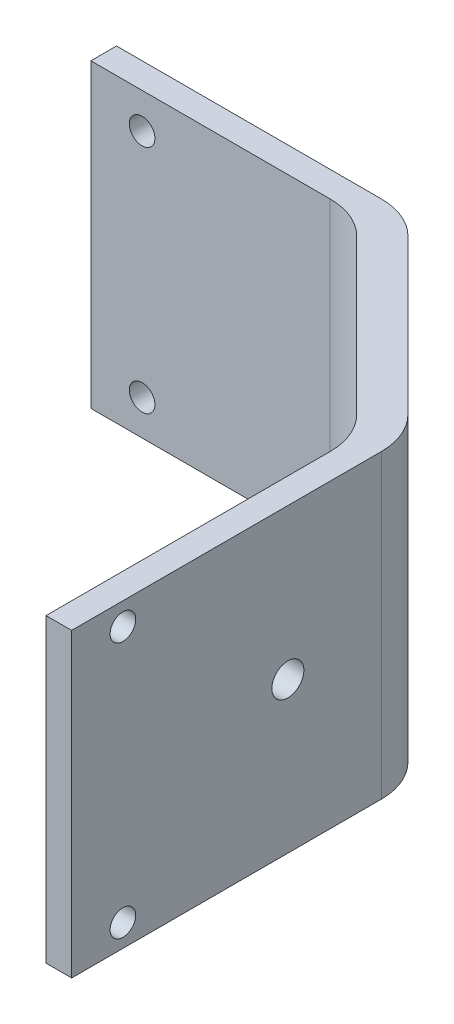
ISO-10303-21;
HEADER;
FILE_DESCRIPTION(('STEP AP214'),'2;1');
FILE_NAME('part.step','',(''),(''),'','','');
FILE_SCHEMA(('AUTOMOTIVE_DESIGN { 1 0 10303 214 1 1 1 1 }'));
ENDSEC;
DATA;
#1=APPLICATION_CONTEXT('core data for automotive mechanical design processes');
#2=APPLICATION_PROTOCOL_DEFINITION('international standard','automotive_design',2000,#1);
#3=PRODUCT_CONTEXT('',#1,'mechanical');
#4=PRODUCT('Part','Part','',(#3));
#5=PRODUCT_RELATED_PRODUCT_CATEGORY('part','',(#4));
#6=PRODUCT_DEFINITION_FORMATION('','',#4);
#7=PRODUCT_DEFINITION_CONTEXT('part definition',#1,'design');
#8=PRODUCT_DEFINITION('design','',#6,#7);
#9=PRODUCT_DEFINITION_SHAPE('','',#8);
#10=(LENGTH_UNIT() NAMED_UNIT(*) SI_UNIT(.MILLI.,.METRE.));
#11=(NAMED_UNIT(*) PLANE_ANGLE_UNIT() SI_UNIT($,.RADIAN.));
#12=(NAMED_UNIT(*) SI_UNIT($,.STERADIAN.) SOLID_ANGLE_UNIT());
#13=UNCERTAINTY_MEASURE_WITH_UNIT(LENGTH_MEASURE(1.E-05),#10,'distance_accuracy_value','');
#14=(GEOMETRIC_REPRESENTATION_CONTEXT(3) GLOBAL_UNCERTAINTY_ASSIGNED_CONTEXT((#13)) GLOBAL_UNIT_ASSIGNED_CONTEXT((#10,
#11,#12)) REPRESENTATION_CONTEXT('',''));
#15=CARTESIAN_POINT('',(0.,0.,0.));
#16=DIRECTION('',(0.,0.,1.));
#17=DIRECTION('',(1.,0.,0.));
#18=AXIS2_PLACEMENT_3D('',#15,#16,#17);
#19=CARTESIAN_POINT('',(0.,11.,4.));
#20=DIRECTION('',(1.,0.,0.));
#21=DIRECTION('',(0.,0.,-1.));
#22=AXIS2_PLACEMENT_3D('',#19,#20,#21);
#23=PLANE('',#22);
#24=DIRECTION('',(0.,-1.,0.));
#25=VECTOR('',#24,1.);
#26=CARTESIAN_POINT('',(0.,11.,0.));
#27=LINE('',#26,#25);
#28=CARTESIAN_POINT('',(0.,47.,0.));
#29=VERTEX_POINT('',#28);
#30=CARTESIAN_POINT('',(0.,0.,0.));
#31=VERTEX_POINT('',#30);
#32=EDGE_CURVE('E229',#29,#31,#27,.T.);
#33=ORIENTED_EDGE('',*,*,#32,.T.);
#34=DIRECTION('',(0.,0.,-1.));
#35=VECTOR('',#34,1.);
#36=CARTESIAN_POINT('',(0.,0.,4.));
#37=LINE('',#36,#35);
#38=CARTESIAN_POINT('',(0.,0.,4.));
#39=VERTEX_POINT('',#38);
#40=EDGE_CURVE('E238',#39,#31,#37,.T.);
#41=ORIENTED_EDGE('',*,*,#40,.F.);
#42=DIRECTION('',(0.,-1.,0.));
#43=VECTOR('',#42,1.);
#44=CARTESIAN_POINT('',(0.,11.,4.));
#45=LINE('',#44,#43);
#46=CARTESIAN_POINT('',(0.,47.,4.));
#47=VERTEX_POINT('',#46);
#48=EDGE_CURVE('E232',#47,#39,#45,.T.);
#49=ORIENTED_EDGE('',*,*,#48,.F.);
#50=DIRECTION('',(0.,0.,-1.));
#51=VECTOR('',#50,1.);
#52=CARTESIAN_POINT('',(0.,47.,80.2971165903404));
#53=LINE('',#52,#51);
#54=EDGE_CURVE('E221',#47,#29,#53,.T.);
#55=ORIENTED_EDGE('',*,*,#54,.T.);
#56=EDGE_LOOP('',(#33,#41,#49,#55));
#57=FACE_BOUND('',#56,.T.);
#58=ADVANCED_FACE('F67',(#57),#23,.F.);
#59=CARTESIAN_POINT('',(0.,0.,4.));
#60=DIRECTION('',(0.,1.,0.));
#61=DIRECTION('',(0.,0.,1.));
#62=AXIS2_PLACEMENT_3D('',#59,#60,#61);
#63=PLANE('',#62);
#64=DIRECTION('',(0.707106781186549,0.,0.707106781186546));
#65=VECTOR('',#64,1.);
#66=CARTESIAN_POINT('',(75.5,0.,30.));
#67=LINE('',#66,#65);
#68=CARTESIAN_POINT('',(48.4289321881344,0.,2.9289321881345));
#69=VERTEX_POINT('',#68);
#70=CARTESIAN_POINT('',(72.5710678118655,0.,27.0710678118655));
#71=VERTEX_POINT('',#70);
#72=EDGE_CURVE('E253',#69,#71,#67,.T.);
#73=ORIENTED_EDGE('',*,*,#72,.T.);
#74=CARTESIAN_POINT('',(65.5,0.,34.142135623731));
#75=DIRECTION('',(0.,1.,0.));
#76=DIRECTION('',(0.,0.,1.));
#77=AXIS2_PLACEMENT_3D('',#74,#75,#76);
#78=CIRCLE('',#77,10.);
#79=CARTESIAN_POINT('',(75.5,0.,34.142135623731));
#80=VERTEX_POINT('',#79);
#81=EDGE_CURVE('E162',#71,#80,#78,.F.);
#82=ORIENTED_EDGE('',*,*,#81,.T.);
#83=DIRECTION('',(0.,0.,-1.));
#84=VECTOR('',#83,1.);
#85=CARTESIAN_POINT('',(75.5,0.,0.));
#86=LINE('',#85,#84);
#87=CARTESIAN_POINT('',(75.5,0.,82.5));
#88=VERTEX_POINT('',#87);
#89=EDGE_CURVE('E155',#88,#80,#86,.T.);
#90=ORIENTED_EDGE('',*,*,#89,.F.);
#91=DIRECTION('',(1.,0.,0.));
#92=VECTOR('',#91,1.);
#93=CARTESIAN_POINT('',(24.4335576020452,0.,82.5));
#94=LINE('',#93,#92);
#95=CARTESIAN_POINT('',(71.5,0.,82.5));
#96=VERTEX_POINT('',#95);
#97=EDGE_CURVE('E160',#96,#88,#94,.T.);
#98=ORIENTED_EDGE('',*,*,#97,.F.);
#99=DIRECTION('',(0.,0.,-1.));
#100=VECTOR('',#99,1.);
#101=CARTESIAN_POINT('',(71.5,0.,80.));
#102=LINE('',#101,#100);
#103=CARTESIAN_POINT('',(71.5,0.,38.1421356237311));
#104=VERTEX_POINT('',#103);
#105=EDGE_CURVE('E168',#96,#104,#102,.T.);
#106=ORIENTED_EDGE('',*,*,#105,.T.);
#107=CARTESIAN_POINT('',(61.5,0.,38.1421356237311));
#108=DIRECTION('',(0.,1.,0.));
#109=DIRECTION('',(0.,0.,1.));
#110=AXIS2_PLACEMENT_3D('',#107,#108,#109);
#111=CIRCLE('',#110,10.);
#112=CARTESIAN_POINT('',(68.5710678118655,0.,31.0710678118657));
#113=VERTEX_POINT('',#112);
#114=EDGE_CURVE('E280',#104,#113,#111,.T.);
#115=ORIENTED_EDGE('',*,*,#114,.T.);
#116=DIRECTION('',(-0.707106781186544,0.,-0.707106781186551));
#117=VECTOR('',#116,1.);
#118=CARTESIAN_POINT('',(20.7500000000003,0.,-16.7500000000001));
#119=LINE('',#118,#117);
#120=CARTESIAN_POINT('',(44.4289321881346,0.,6.92893218813456));
#121=VERTEX_POINT('',#120);
#122=EDGE_CURVE('E245',#113,#121,#119,.T.);
#123=ORIENTED_EDGE('',*,*,#122,.T.);
#124=CARTESIAN_POINT('',(37.3578643762691,0.,14.));
#125=DIRECTION('',(0.,1.,0.));
#126=DIRECTION('',(0.,0.,1.));
#127=AXIS2_PLACEMENT_3D('',#124,#125,#126);
#128=CIRCLE('',#127,10.);
#129=CARTESIAN_POINT('',(37.3578643762691,0.,4.));
#130=VERTEX_POINT('',#129);
#131=EDGE_CURVE('E12',#121,#130,#128,.T.);
#132=ORIENTED_EDGE('',*,*,#131,.T.);
#133=DIRECTION('',(1.,0.,0.));
#134=VECTOR('',#133,1.);
#135=CARTESIAN_POINT('',(0.,0.,4.));
#136=LINE('',#135,#134);
#137=EDGE_CURVE('E235',#39,#130,#136,.T.);
#138=ORIENTED_EDGE('',*,*,#137,.F.);
#139=ORIENTED_EDGE('',*,*,#40,.T.);
#140=DIRECTION('',(1.,0.,0.));
#141=VECTOR('',#140,1.);
#142=CARTESIAN_POINT('',(0.,0.,0.));
#143=LINE('',#142,#141);
#144=CARTESIAN_POINT('',(41.357864376269,0.,0.));
#145=VERTEX_POINT('',#144);
#146=EDGE_CURVE('E236',#31,#145,#143,.T.);
#147=ORIENTED_EDGE('',*,*,#146,.T.);
#148=CARTESIAN_POINT('',(41.357864376269,0.,10.));
#149=DIRECTION('',(0.,1.,0.));
#150=DIRECTION('',(0.,0.,1.));
#151=AXIS2_PLACEMENT_3D('',#148,#149,#150);
#152=CIRCLE('',#151,10.);
#153=EDGE_CURVE('E265',#145,#69,#152,.F.);
#154=ORIENTED_EDGE('',*,*,#153,.T.);
#155=EDGE_LOOP('',(#73,#82,#90,#98,#106,#115,#123,#132,#138,#139,#147,#154));
#156=FACE_BOUND('',#155,.T.);
#157=ADVANCED_FACE('F158',(#156),#63,.F.);
#158=CARTESIAN_POINT('',(0.,0.,4.));
#159=DIRECTION('',(0.,0.,1.));
#160=DIRECTION('',(1.,0.,0.));
#161=AXIS2_PLACEMENT_3D('',#158,#159,#160);
#162=PLANE('',#161);
#163=ORIENTED_EDGE('',*,*,#137,.T.);
#164=DIRECTION('',(0.,1.,0.));
#165=VECTOR('',#164,1.);
#166=CARTESIAN_POINT('',(37.3578643762691,0.,4.));
#167=LINE('',#166,#165);
#168=CARTESIAN_POINT('',(37.3578643762691,47.,4.));
#169=VERTEX_POINT('',#168);
#170=EDGE_CURVE('E274',#130,#169,#167,.T.);
#171=ORIENTED_EDGE('',*,*,#170,.T.);
#172=DIRECTION('',(1.,0.,0.));
#173=VECTOR('',#172,1.);
#174=CARTESIAN_POINT('',(0.,47.,4.));
#175=LINE('',#174,#173);
#176=EDGE_CURVE('E209',#47,#169,#175,.T.);
#177=ORIENTED_EDGE('',*,*,#176,.F.);
#178=ORIENTED_EDGE('',*,*,#48,.T.);
#179=EDGE_LOOP('',(#163,#171,#177,#178));
#180=FACE_BOUND('',#179,.T.);
#181=CARTESIAN_POINT('',(8.,5.5,4.));
#182=DIRECTION('',(0.,0.,1.));
#183=DIRECTION('',(1.,0.,0.));
#184=AXIS2_PLACEMENT_3D('',#181,#182,#183);
#185=CIRCLE('',#184,2.);
#186=CARTESIAN_POINT('',(10.,5.5,4.));
#187=VERTEX_POINT('',#186);
#188=EDGE_CURVE('E167',#187,#187,#185,.T.);
#189=ORIENTED_EDGE('',*,*,#188,.F.);
#190=EDGE_LOOP('',(#189));
#191=FACE_BOUND('',#190,.T.);
#192=CARTESIAN_POINT('',(8.,41.5,4.));
#193=DIRECTION('',(0.,0.,1.));
#194=DIRECTION('',(1.,0.,0.));
#195=AXIS2_PLACEMENT_3D('',#192,#193,#194);
#196=CIRCLE('',#195,2.);
#197=CARTESIAN_POINT('',(10.,41.5,4.));
#198=VERTEX_POINT('',#197);
#199=EDGE_CURVE('E213',#198,#198,#196,.F.);
#200=ORIENTED_EDGE('',*,*,#199,.T.);
#201=EDGE_LOOP('',(#200));
#202=FACE_BOUND('',#201,.T.);
#203=ADVANCED_FACE('F294',(#180,#191,#202),#162,.T.);
#204=CARTESIAN_POINT('',(0.,0.,0.));
#205=DIRECTION('',(0.,0.,1.));
#206=DIRECTION('',(1.,0.,0.));
#207=AXIS2_PLACEMENT_3D('',#204,#205,#206);
#208=PLANE('',#207);
#209=CARTESIAN_POINT('',(8.,5.5,0.));
#210=DIRECTION('',(0.,0.,1.));
#211=DIRECTION('',(1.,0.,0.));
#212=AXIS2_PLACEMENT_3D('',#209,#210,#211);
#213=CIRCLE('',#212,2.);
#214=CARTESIAN_POINT('',(10.,5.5,0.));
#215=VERTEX_POINT('',#214);
#216=EDGE_CURVE('E226',#215,#215,#213,.T.);
#217=ORIENTED_EDGE('',*,*,#216,.T.);
#218=EDGE_LOOP('',(#217));
#219=FACE_BOUND('',#218,.T.);
#220=DIRECTION('',(1.,0.,0.));
#221=VECTOR('',#220,1.);
#222=CARTESIAN_POINT('',(0.,47.,0.));
#223=LINE('',#222,#221);
#224=CARTESIAN_POINT('',(41.357864376269,47.,0.));
#225=VERTEX_POINT('',#224);
#226=EDGE_CURVE('E218',#29,#225,#223,.T.);
#227=ORIENTED_EDGE('',*,*,#226,.T.);
#228=DIRECTION('',(0.,-1.,0.));
#229=VECTOR('',#228,1.);
#230=CARTESIAN_POINT('',(41.357864376269,0.,0.));
#231=LINE('',#230,#229);
#232=EDGE_CURVE('E277',#225,#145,#231,.T.);
#233=ORIENTED_EDGE('',*,*,#232,.T.);
#234=ORIENTED_EDGE('',*,*,#146,.F.);
#235=ORIENTED_EDGE('',*,*,#32,.F.);
#236=EDGE_LOOP('',(#227,#233,#234,#235));
#237=FACE_BOUND('',#236,.T.);
#238=CARTESIAN_POINT('',(8.,41.5,0.));
#239=DIRECTION('',(0.,0.,-1.));
#240=DIRECTION('',(-1.,0.,0.));
#241=AXIS2_PLACEMENT_3D('',#238,#239,#240);
#242=CIRCLE('',#241,2.);
#243=CARTESIAN_POINT('',(6.,41.5,0.));
#244=VERTEX_POINT('',#243);
#245=EDGE_CURVE('E212',#244,#244,#242,.T.);
#246=ORIENTED_EDGE('',*,*,#245,.F.);
#247=EDGE_LOOP('',(#246));
#248=FACE_BOUND('',#247,.T.);
#249=ADVANCED_FACE('F300',(#219,#237,#248),#208,.F.);
#250=CARTESIAN_POINT('',(8.,5.5,0.));
#251=DIRECTION('',(0.,0.,1.));
#252=DIRECTION('',(1.,0.,0.));
#253=AXIS2_PLACEMENT_3D('',#250,#251,#252);
#254=CYLINDRICAL_SURFACE('',#253,2.);
#255=ORIENTED_EDGE('',*,*,#216,.F.);
#256=EDGE_LOOP('',(#255));
#257=FACE_BOUND('',#256,.T.);
#258=ORIENTED_EDGE('',*,*,#188,.T.);
#259=EDGE_LOOP('',(#258));
#260=FACE_BOUND('',#259,.T.);
#261=ADVANCED_FACE('F373',(#257,#260),#254,.F.);
#262=CARTESIAN_POINT('',(75.5,0.,0.));
#263=DIRECTION('',(1.,0.,0.));
#264=DIRECTION('',(0.,0.,-1.));
#265=AXIS2_PLACEMENT_3D('',#262,#263,#264);
#266=PLANE('',#265);
#267=CARTESIAN_POINT('',(75.5,43.5,74.5));
#268=DIRECTION('',(1.,0.,0.));
#269=DIRECTION('',(0.,0.,-1.));
#270=AXIS2_PLACEMENT_3D('',#267,#268,#269);
#271=CIRCLE('',#270,2.);
#272=CARTESIAN_POINT('',(75.5,43.5,72.5));
#273=VERTEX_POINT('',#272);
#274=EDGE_CURVE('E188',#273,#273,#271,.T.);
#275=ORIENTED_EDGE('',*,*,#274,.F.);
#276=EDGE_LOOP('',(#275));
#277=FACE_BOUND('',#276,.T.);
#278=CARTESIAN_POINT('',(75.5,3.49999999999999,74.5));
#279=DIRECTION('',(1.,0.,0.));
#280=DIRECTION('',(0.,0.,-1.));
#281=AXIS2_PLACEMENT_3D('',#278,#279,#280);
#282=CIRCLE('',#281,2.);
#283=CARTESIAN_POINT('',(75.5,3.49999999999999,72.5));
#284=VERTEX_POINT('',#283);
#285=EDGE_CURVE('E192',#284,#284,#282,.T.);
#286=ORIENTED_EDGE('',*,*,#285,.F.);
#287=EDGE_LOOP('',(#286));
#288=FACE_BOUND('',#287,.T.);
#289=CARTESIAN_POINT('',(75.5,23.5,48.75));
#290=DIRECTION('',(1.,0.,0.));
#291=DIRECTION('',(0.,0.,-1.));
#292=AXIS2_PLACEMENT_3D('',#289,#290,#291);
#293=CIRCLE('',#292,2.5);
#294=CARTESIAN_POINT('',(75.5,23.5,46.25));
#295=VERTEX_POINT('',#294);
#296=EDGE_CURVE('E195',#295,#295,#293,.T.);
#297=ORIENTED_EDGE('',*,*,#296,.F.);
#298=EDGE_LOOP('',(#297));
#299=FACE_BOUND('',#298,.T.);
#300=ORIENTED_EDGE('',*,*,#89,.T.);
#301=DIRECTION('',(0.,1.,0.));
#302=VECTOR('',#301,1.);
#303=CARTESIAN_POINT('',(75.5,0.,34.142135623731));
#304=LINE('',#303,#302);
#305=CARTESIAN_POINT('',(75.5,47.,34.142135623731));
#306=VERTEX_POINT('',#305);
#307=EDGE_CURVE('E255',#80,#306,#304,.T.);
#308=ORIENTED_EDGE('',*,*,#307,.T.);
#309=DIRECTION('',(0.,0.,-1.));
#310=VECTOR('',#309,1.);
#311=CARTESIAN_POINT('',(75.5,47.,80.2971165903404));
#312=LINE('',#311,#310);
#313=CARTESIAN_POINT('',(75.5,47.,82.5));
#314=VERTEX_POINT('',#313);
#315=EDGE_CURVE('E182',#314,#306,#312,.T.);
#316=ORIENTED_EDGE('',*,*,#315,.F.);
#317=DIRECTION('',(0.,-1.,0.));
#318=VECTOR('',#317,1.);
#319=CARTESIAN_POINT('',(75.5,3.49999999999999,82.5));
#320=LINE('',#319,#318);
#321=EDGE_CURVE('E175',#314,#88,#320,.T.);
#322=ORIENTED_EDGE('',*,*,#321,.T.);
#323=EDGE_LOOP('',(#300,#308,#316,#322));
#324=FACE_BOUND('',#323,.T.);
#325=ADVANCED_FACE('F180',(#277,#288,#299,#324),#266,.T.);
#326=CARTESIAN_POINT('',(71.5,11.,80.));
#327=DIRECTION('',(1.,0.,0.));
#328=DIRECTION('',(0.,0.,-1.));
#329=AXIS2_PLACEMENT_3D('',#326,#327,#328);
#330=PLANE('',#329);
#331=CARTESIAN_POINT('',(71.5,43.5,74.5));
#332=DIRECTION('',(1.,0.,0.));
#333=DIRECTION('',(0.,0.,-1.));
#334=AXIS2_PLACEMENT_3D('',#331,#332,#333);
#335=CIRCLE('',#334,2.);
#336=CARTESIAN_POINT('',(71.5,43.5,72.5));
#337=VERTEX_POINT('',#336);
#338=EDGE_CURVE('E191',#337,#337,#335,.F.);
#339=ORIENTED_EDGE('',*,*,#338,.F.);
#340=EDGE_LOOP('',(#339));
#341=FACE_BOUND('',#340,.T.);
#342=CARTESIAN_POINT('',(71.5,3.49999999999999,74.5));
#343=DIRECTION('',(1.,0.,0.));
#344=DIRECTION('',(0.,0.,-1.));
#345=AXIS2_PLACEMENT_3D('',#342,#343,#344);
#346=CIRCLE('',#345,2.);
#347=CARTESIAN_POINT('',(71.5,3.49999999999999,72.5));
#348=VERTEX_POINT('',#347);
#349=EDGE_CURVE('E196',#348,#348,#346,.F.);
#350=ORIENTED_EDGE('',*,*,#349,.F.);
#351=EDGE_LOOP('',(#350));
#352=FACE_BOUND('',#351,.T.);
#353=CARTESIAN_POINT('',(71.5,23.5,48.75));
#354=DIRECTION('',(1.,0.,0.));
#355=DIRECTION('',(0.,0.,-1.));
#356=AXIS2_PLACEMENT_3D('',#353,#354,#355);
#357=CIRCLE('',#356,2.5);
#358=CARTESIAN_POINT('',(71.5,23.5,46.25));
#359=VERTEX_POINT('',#358);
#360=EDGE_CURVE('E203',#359,#359,#357,.F.);
#361=ORIENTED_EDGE('',*,*,#360,.F.);
#362=EDGE_LOOP('',(#361));
#363=FACE_BOUND('',#362,.T.);
#364=DIRECTION('',(0.,0.,-1.));
#365=VECTOR('',#364,1.);
#366=CARTESIAN_POINT('',(71.5,47.,0.));
#367=LINE('',#366,#365);
#368=CARTESIAN_POINT('',(71.5,47.,82.5));
#369=VERTEX_POINT('',#368);
#370=CARTESIAN_POINT('',(71.5,47.,38.1421356237311));
#371=VERTEX_POINT('',#370);
#372=EDGE_CURVE('E206',#369,#371,#367,.T.);
#373=ORIENTED_EDGE('',*,*,#372,.T.);
#374=DIRECTION('',(0.,-1.,0.));
#375=VECTOR('',#374,1.);
#376=CARTESIAN_POINT('',(71.5,0.,38.1421356237311));
#377=LINE('',#376,#375);
#378=EDGE_CURVE('E268',#371,#104,#377,.T.);
#379=ORIENTED_EDGE('',*,*,#378,.T.);
#380=ORIENTED_EDGE('',*,*,#105,.F.);
#381=DIRECTION('',(0.,1.,0.));
#382=VECTOR('',#381,1.);
#383=CARTESIAN_POINT('',(71.5,3.49999999999999,82.5));
#384=LINE('',#383,#382);
#385=EDGE_CURVE('E177',#96,#369,#384,.T.);
#386=ORIENTED_EDGE('',*,*,#385,.T.);
#387=EDGE_LOOP('',(#373,#379,#380,#386));
#388=FACE_BOUND('',#387,.T.);
#389=ADVANCED_FACE('F315',(#341,#352,#363,#388),#330,.F.);
#390=CARTESIAN_POINT('',(8.,41.5,80.2971165903404));
#391=DIRECTION('',(0.,0.,-1.));
#392=DIRECTION('',(-1.,0.,0.));
#393=AXIS2_PLACEMENT_3D('',#390,#391,#392);
#394=CYLINDRICAL_SURFACE('',#393,2.);
#395=ORIENTED_EDGE('',*,*,#245,.T.);
#396=EDGE_LOOP('',(#395));
#397=FACE_BOUND('',#396,.T.);
#398=ORIENTED_EDGE('',*,*,#199,.F.);
#399=EDGE_LOOP('',(#398));
#400=FACE_BOUND('',#399,.T.);
#401=ADVANCED_FACE('F364',(#397,#400),#394,.F.);
#402=CARTESIAN_POINT('',(0.,47.,80.2971165903404));
#403=DIRECTION('',(0.,1.,0.));
#404=DIRECTION('',(0.,0.,1.));
#405=AXIS2_PLACEMENT_3D('',#402,#403,#404);
#406=PLANE('',#405);
#407=ORIENTED_EDGE('',*,*,#315,.T.);
#408=CARTESIAN_POINT('',(65.5,47.,34.142135623731));
#409=DIRECTION('',(0.,1.,0.));
#410=DIRECTION('',(0.,0.,1.));
#411=AXIS2_PLACEMENT_3D('',#408,#409,#410);
#412=CIRCLE('',#411,10.);
#413=CARTESIAN_POINT('',(72.5710678118655,47.,27.0710678118655));
#414=VERTEX_POINT('',#413);
#415=EDGE_CURVE('E259',#306,#414,#412,.T.);
#416=ORIENTED_EDGE('',*,*,#415,.T.);
#417=DIRECTION('',(-0.707106781186549,0.,-0.707106781186546));
#418=VECTOR('',#417,1.);
#419=CARTESIAN_POINT('',(62.8985582951701,47.,17.3985582951701));
#420=LINE('',#419,#418);
#421=CARTESIAN_POINT('',(48.4289321881344,47.,2.9289321881345));
#422=VERTEX_POINT('',#421);
#423=EDGE_CURVE('E250',#414,#422,#420,.T.);
#424=ORIENTED_EDGE('',*,*,#423,.T.);
#425=CARTESIAN_POINT('',(41.357864376269,47.,10.));
#426=DIRECTION('',(0.,1.,0.));
#427=DIRECTION('',(0.,0.,1.));
#428=AXIS2_PLACEMENT_3D('',#425,#426,#427);
#429=CIRCLE('',#428,10.);
#430=EDGE_CURVE('E257',#422,#225,#429,.T.);
#431=ORIENTED_EDGE('',*,*,#430,.T.);
#432=ORIENTED_EDGE('',*,*,#226,.F.);
#433=ORIENTED_EDGE('',*,*,#54,.F.);
#434=ORIENTED_EDGE('',*,*,#176,.T.);
#435=CARTESIAN_POINT('',(37.3578643762691,47.,14.));
#436=DIRECTION('',(0.,1.,0.));
#437=DIRECTION('',(0.,0.,1.));
#438=AXIS2_PLACEMENT_3D('',#435,#436,#437);
#439=CIRCLE('',#438,10.);
#440=CARTESIAN_POINT('',(44.4289321881346,47.,6.92893218813457));
#441=VERTEX_POINT('',#440);
#442=EDGE_CURVE('E75',#169,#441,#439,.F.);
#443=ORIENTED_EDGE('',*,*,#442,.T.);
#444=DIRECTION('',(0.707106781186544,0.,0.707106781186551));
#445=VECTOR('',#444,1.);
#446=CARTESIAN_POINT('',(71.5,47.,34.0000000000002));
#447=LINE('',#446,#445);
#448=CARTESIAN_POINT('',(68.5710678118655,47.,31.0710678118657));
#449=VERTEX_POINT('',#448);
#450=EDGE_CURVE('E247',#441,#449,#447,.T.);
#451=ORIENTED_EDGE('',*,*,#450,.T.);
#452=CARTESIAN_POINT('',(61.5,47.,38.1421356237311));
#453=DIRECTION('',(0.,1.,0.));
#454=DIRECTION('',(0.,0.,1.));
#455=AXIS2_PLACEMENT_3D('',#452,#453,#454);
#456=CIRCLE('',#455,10.);
#457=EDGE_CURVE('E282',#449,#371,#456,.F.);
#458=ORIENTED_EDGE('',*,*,#457,.T.);
#459=ORIENTED_EDGE('',*,*,#372,.F.);
#460=DIRECTION('',(1.,0.,0.));
#461=VECTOR('',#460,1.);
#462=CARTESIAN_POINT('',(24.4335576020452,47.,82.5));
#463=LINE('',#462,#461);
#464=EDGE_CURVE('E178',#369,#314,#463,.T.);
#465=ORIENTED_EDGE('',*,*,#464,.T.);
#466=EDGE_LOOP('',(#407,#416,#424,#431,#432,#433,#434,#443,#451,#458,#459,#465));
#467=FACE_BOUND('',#466,.T.);
#468=ADVANCED_FACE('F284',(#467),#406,.T.);
#469=CARTESIAN_POINT('',(64.4289321881345,23.5,48.75));
#470=DIRECTION('',(1.,0.,0.));
#471=DIRECTION('',(0.,0.,-1.));
#472=AXIS2_PLACEMENT_3D('',#469,#470,#471);
#473=CYLINDRICAL_SURFACE('',#472,2.5);
#474=ORIENTED_EDGE('',*,*,#360,.T.);
#475=EDGE_LOOP('',(#474));
#476=FACE_BOUND('',#475,.T.);
#477=ORIENTED_EDGE('',*,*,#296,.T.);
#478=EDGE_LOOP('',(#477));
#479=FACE_BOUND('',#478,.T.);
#480=ADVANCED_FACE('F340',(#476,#479),#473,.F.);
#481=CARTESIAN_POINT('',(71.5,11.,34.0000000000002));
#482=DIRECTION('',(0.707106781186551,0.,-0.707106781186544));
#483=DIRECTION('',(0.,-1.,0.));
#484=AXIS2_PLACEMENT_3D('',#481,#482,#483);
#485=PLANE('',#484);
#486=ORIENTED_EDGE('',*,*,#122,.F.);
#487=DIRECTION('',(0.,-1.,0.));
#488=VECTOR('',#487,1.);
#489=CARTESIAN_POINT('',(68.5710678118655,47.,31.0710678118657));
#490=LINE('',#489,#488);
#491=EDGE_CURVE('E272',#113,#449,#490,.F.);
#492=ORIENTED_EDGE('',*,*,#491,.T.);
#493=ORIENTED_EDGE('',*,*,#450,.F.);
#494=DIRECTION('',(0.,1.,0.));
#495=VECTOR('',#494,1.);
#496=CARTESIAN_POINT('',(44.4289321881346,11.,6.92893218813457));
#497=LINE('',#496,#495);
#498=EDGE_CURVE('E88',#441,#121,#497,.F.);
#499=ORIENTED_EDGE('',*,*,#498,.T.);
#500=EDGE_LOOP('',(#486,#492,#493,#499));
#501=FACE_BOUND('',#500,.T.);
#502=ADVANCED_FACE('F290',(#501),#485,.F.);
#503=CARTESIAN_POINT('',(75.5,0.,30.));
#504=DIRECTION('',(0.707106781186546,0.,-0.707106781186549));
#505=DIRECTION('',(0.,-1.,0.));
#506=AXIS2_PLACEMENT_3D('',#503,#504,#505);
#507=PLANE('',#506);
#508=ORIENTED_EDGE('',*,*,#423,.F.);
#509=DIRECTION('',(0.,1.,0.));
#510=VECTOR('',#509,1.);
#511=CARTESIAN_POINT('',(72.5710678118655,0.,27.0710678118655));
#512=LINE('',#511,#510);
#513=EDGE_CURVE('E263',#414,#71,#512,.F.);
#514=ORIENTED_EDGE('',*,*,#513,.T.);
#515=ORIENTED_EDGE('',*,*,#72,.F.);
#516=DIRECTION('',(0.,-1.,0.));
#517=VECTOR('',#516,1.);
#518=CARTESIAN_POINT('',(48.4289321881344,47.,2.92893218813451));
#519=LINE('',#518,#517);
#520=EDGE_CURVE('E261',#69,#422,#519,.F.);
#521=ORIENTED_EDGE('',*,*,#520,.T.);
#522=EDGE_LOOP('',(#508,#514,#515,#521));
#523=FACE_BOUND('',#522,.T.);
#524=ADVANCED_FACE('F309',(#523),#507,.T.);
#525=CARTESIAN_POINT('',(65.8431457505076,3.49999999999999,74.5));
#526=DIRECTION('',(1.,0.,0.));
#527=DIRECTION('',(0.,0.,-1.));
#528=AXIS2_PLACEMENT_3D('',#525,#526,#527);
#529=CYLINDRICAL_SURFACE('',#528,2.);
#530=CARTESIAN_POINT('',(71.5,3.49999999999999,72.5));
#531=CARTESIAN_POINT('',(71.5416666666667,3.49999999999999,72.5));
#532=CARTESIAN_POINT('',(71.5833333333333,3.49999999999999,72.5));
#533=CARTESIAN_POINT('',(71.6666666666667,3.49999999999999,72.5));
#534=CARTESIAN_POINT('',(71.7083333333333,3.49999999999999,72.5));
#535=CARTESIAN_POINT('',(71.7916666666667,3.49999999999999,72.5));
#536=CARTESIAN_POINT('',(71.8333333333333,3.49999999999999,72.5));
#537=CARTESIAN_POINT('',(71.9166666666667,3.49999999999999,72.5));
#538=CARTESIAN_POINT('',(71.9583333333333,3.49999999999999,72.5));
#539=CARTESIAN_POINT('',(72.0416666666667,3.49999999999999,72.5));
#540=CARTESIAN_POINT('',(72.0833333333333,3.49999999999999,72.5));
#541=CARTESIAN_POINT('',(72.1666666666667,3.49999999999999,72.5));
#542=CARTESIAN_POINT('',(72.2083333333333,3.49999999999999,72.5));
#543=CARTESIAN_POINT('',(72.2916666666667,3.49999999999999,72.5));
#544=CARTESIAN_POINT('',(72.3333333333333,3.49999999999999,72.5));
#545=CARTESIAN_POINT('',(72.4166666666667,3.49999999999999,72.5));
#546=CARTESIAN_POINT('',(72.4583333333333,3.49999999999999,72.5));
#547=CARTESIAN_POINT('',(72.5416666666667,3.49999999999999,72.5));
#548=CARTESIAN_POINT('',(72.5833333333333,3.49999999999999,72.5));
#549=CARTESIAN_POINT('',(72.6666666666667,3.49999999999999,72.5));
#550=CARTESIAN_POINT('',(72.7083333333333,3.49999999999999,72.5));
#551=CARTESIAN_POINT('',(72.7916666666667,3.49999999999999,72.5));
#552=CARTESIAN_POINT('',(72.8333333333333,3.49999999999999,72.5));
#553=CARTESIAN_POINT('',(72.9166666666667,3.49999999999999,72.5));
#554=CARTESIAN_POINT('',(72.9583333333333,3.49999999999999,72.5));
#555=CARTESIAN_POINT('',(73.0416666666667,3.49999999999999,72.5));
#556=CARTESIAN_POINT('',(73.0833333333333,3.49999999999999,72.5));
#557=CARTESIAN_POINT('',(73.1666666666667,3.49999999999999,72.5));
#558=CARTESIAN_POINT('',(73.2083333333333,3.49999999999999,72.5));
#559=CARTESIAN_POINT('',(73.2916666666667,3.49999999999999,72.5));
#560=CARTESIAN_POINT('',(73.3333333333333,3.49999999999999,72.5));
#561=CARTESIAN_POINT('',(73.4166666666667,3.49999999999999,72.5));
#562=CARTESIAN_POINT('',(73.4583333333333,3.49999999999999,72.5));
#563=CARTESIAN_POINT('',(73.5416666666667,3.49999999999999,72.5));
#564=CARTESIAN_POINT('',(73.5833333333333,3.49999999999999,72.5));
#565=CARTESIAN_POINT('',(73.6666666666667,3.49999999999999,72.5));
#566=CARTESIAN_POINT('',(73.7083333333333,3.49999999999999,72.5));
#567=CARTESIAN_POINT('',(73.7916666666667,3.49999999999999,72.5));
#568=CARTESIAN_POINT('',(73.8333333333333,3.49999999999999,72.5));
#569=CARTESIAN_POINT('',(73.9166666666667,3.49999999999999,72.5));
#570=CARTESIAN_POINT('',(73.9583333333333,3.49999999999999,72.5));
#571=CARTESIAN_POINT('',(74.0416666666667,3.49999999999999,72.5));
#572=CARTESIAN_POINT('',(74.0833333333333,3.49999999999999,72.5));
#573=CARTESIAN_POINT('',(74.1666666666667,3.49999999999999,72.5));
#574=CARTESIAN_POINT('',(74.2083333333333,3.49999999999999,72.5));
#575=CARTESIAN_POINT('',(74.2916666666667,3.49999999999999,72.5));
#576=CARTESIAN_POINT('',(74.3333333333333,3.49999999999999,72.5));
#577=CARTESIAN_POINT('',(74.4166666666667,3.49999999999999,72.5));
#578=CARTESIAN_POINT('',(74.4583333333333,3.49999999999999,72.5));
#579=CARTESIAN_POINT('',(74.5416666666667,3.49999999999999,72.5));
#580=CARTESIAN_POINT('',(74.5833333333333,3.49999999999999,72.5));
#581=CARTESIAN_POINT('',(74.6666666666667,3.49999999999999,72.5));
#582=CARTESIAN_POINT('',(74.7083333333333,3.49999999999999,72.5));
#583=CARTESIAN_POINT('',(74.7916666666667,3.49999999999999,72.5));
#584=CARTESIAN_POINT('',(74.8333333333333,3.49999999999999,72.5));
#585=CARTESIAN_POINT('',(74.9166666666667,3.49999999999999,72.5));
#586=CARTESIAN_POINT('',(74.9583333333333,3.49999999999999,72.5));
#587=CARTESIAN_POINT('',(75.0416666666667,3.49999999999999,72.5));
#588=CARTESIAN_POINT('',(75.0833333333333,3.49999999999999,72.5));
#589=CARTESIAN_POINT('',(75.1666666666667,3.49999999999999,72.5));
#590=CARTESIAN_POINT('',(75.2083333333333,3.49999999999999,72.5));
#591=CARTESIAN_POINT('',(75.2916666666667,3.49999999999999,72.5));
#592=CARTESIAN_POINT('',(75.3333333333333,3.49999999999999,72.5));
#593=CARTESIAN_POINT('',(75.4166666666667,3.49999999999999,72.5));
#594=CARTESIAN_POINT('',(75.4583333333333,3.49999999999999,72.5));
#595=CARTESIAN_POINT('',(75.5,3.49999999999999,72.5));
#596=B_SPLINE_CURVE_WITH_KNOTS('',3,(#530,#531,#532,#533,#534,#535,#536,#537,#538,#539,#540,
#541,#542,#543,#544,#545,#546,#547,#548,#549,#550,#551,#552,#553,#554,#555,#556,#557,#558,#559,
#560,#561,#562,#563,#564,#565,#566,#567,#568,#569,#570,#571,#572,#573,#574,#575,#576,#577,#578,
#579,#580,#581,#582,#583,#584,#585,#586,#587,#588,#589,#590,#591,#592,#593,#594,#595),
.UNSPECIFIED.,.F.,.F.,(4,2,2,2,2,2,2,2,2,2,2,2,2,2,2,2,2,2,2,2,2,2,2,2,2,2,2,2,2,2,2,2,4),(0.,
0.125,0.25,0.375,0.5,0.625000000000001,0.750000000000001,0.875000000000001,1.,1.125,1.25,1.375,
1.5,1.625,1.75,1.875,2.,2.125,2.25,2.375,2.5,2.625,2.75,2.875,3.,3.125,3.25,3.375,3.5,3.625,
3.75,3.875,4.),.UNSPECIFIED.);
#597=EDGE_CURVE('BSEAM344',#348,#284,#596,.T.);
#598=ORIENTED_EDGE('',*,*,#349,.T.);
#599=ORIENTED_EDGE('',*,*,#285,.T.);
#600=ORIENTED_EDGE('',*,*,#597,.T.);
#601=ORIENTED_EDGE('',*,*,#597,.F.);
#602=EDGE_LOOP('',(#598,#600,#599,#601));
#603=FACE_BOUND('',#602,.T.);
#604=ADVANCED_FACE('F344',(#603),#529,.F.);
#605=CARTESIAN_POINT('',(65.8431457505076,43.5,74.5));
#606=DIRECTION('',(1.,0.,0.));
#607=DIRECTION('',(0.,0.,-1.));
#608=AXIS2_PLACEMENT_3D('',#605,#606,#607);
#609=CYLINDRICAL_SURFACE('',#608,2.);
#610=CARTESIAN_POINT('',(71.5,43.5,72.5));
#611=CARTESIAN_POINT('',(71.5416666666667,43.5,72.5));
#612=CARTESIAN_POINT('',(71.5833333333333,43.5,72.5));
#613=CARTESIAN_POINT('',(71.6666666666667,43.5,72.5));
#614=CARTESIAN_POINT('',(71.7083333333333,43.5,72.5));
#615=CARTESIAN_POINT('',(71.7916666666667,43.5,72.5));
#616=CARTESIAN_POINT('',(71.8333333333333,43.5,72.5));
#617=CARTESIAN_POINT('',(71.9166666666667,43.5,72.5));
#618=CARTESIAN_POINT('',(71.9583333333333,43.5,72.5));
#619=CARTESIAN_POINT('',(72.0416666666667,43.5,72.5));
#620=CARTESIAN_POINT('',(72.0833333333333,43.5,72.5));
#621=CARTESIAN_POINT('',(72.1666666666667,43.5,72.5));
#622=CARTESIAN_POINT('',(72.2083333333333,43.5,72.5));
#623=CARTESIAN_POINT('',(72.2916666666667,43.5,72.5));
#624=CARTESIAN_POINT('',(72.3333333333333,43.5,72.5));
#625=CARTESIAN_POINT('',(72.4166666666667,43.5,72.5));
#626=CARTESIAN_POINT('',(72.4583333333333,43.5,72.5));
#627=CARTESIAN_POINT('',(72.5416666666667,43.5,72.5));
#628=CARTESIAN_POINT('',(72.5833333333333,43.5,72.5));
#629=CARTESIAN_POINT('',(72.6666666666667,43.5,72.5));
#630=CARTESIAN_POINT('',(72.7083333333333,43.5,72.5));
#631=CARTESIAN_POINT('',(72.7916666666667,43.5,72.5));
#632=CARTESIAN_POINT('',(72.8333333333333,43.5,72.5));
#633=CARTESIAN_POINT('',(72.9166666666667,43.5,72.5));
#634=CARTESIAN_POINT('',(72.9583333333333,43.5,72.5));
#635=CARTESIAN_POINT('',(73.0416666666667,43.5,72.5));
#636=CARTESIAN_POINT('',(73.0833333333333,43.5,72.5));
#637=CARTESIAN_POINT('',(73.1666666666667,43.5,72.5));
#638=CARTESIAN_POINT('',(73.2083333333333,43.5,72.5));
#639=CARTESIAN_POINT('',(73.2916666666667,43.5,72.5));
#640=CARTESIAN_POINT('',(73.3333333333333,43.5,72.5));
#641=CARTESIAN_POINT('',(73.4166666666667,43.5,72.5));
#642=CARTESIAN_POINT('',(73.4583333333333,43.5,72.5));
#643=CARTESIAN_POINT('',(73.5416666666667,43.5,72.5));
#644=CARTESIAN_POINT('',(73.5833333333333,43.5,72.5));
#645=CARTESIAN_POINT('',(73.6666666666667,43.5,72.5));
#646=CARTESIAN_POINT('',(73.7083333333333,43.5,72.5));
#647=CARTESIAN_POINT('',(73.7916666666667,43.5,72.5));
#648=CARTESIAN_POINT('',(73.8333333333333,43.5,72.5));
#649=CARTESIAN_POINT('',(73.9166666666667,43.5,72.5));
#650=CARTESIAN_POINT('',(73.9583333333333,43.5,72.5));
#651=CARTESIAN_POINT('',(74.0416666666667,43.5,72.5));
#652=CARTESIAN_POINT('',(74.0833333333333,43.5,72.5));
#653=CARTESIAN_POINT('',(74.1666666666667,43.5,72.5));
#654=CARTESIAN_POINT('',(74.2083333333333,43.5,72.5));
#655=CARTESIAN_POINT('',(74.2916666666667,43.5,72.5));
#656=CARTESIAN_POINT('',(74.3333333333333,43.5,72.5));
#657=CARTESIAN_POINT('',(74.4166666666667,43.5,72.5));
#658=CARTESIAN_POINT('',(74.4583333333333,43.5,72.5));
#659=CARTESIAN_POINT('',(74.5416666666667,43.5,72.5));
#660=CARTESIAN_POINT('',(74.5833333333333,43.5,72.5));
#661=CARTESIAN_POINT('',(74.6666666666667,43.5,72.5));
#662=CARTESIAN_POINT('',(74.7083333333333,43.5,72.5));
#663=CARTESIAN_POINT('',(74.7916666666667,43.5,72.5));
#664=CARTESIAN_POINT('',(74.8333333333333,43.5,72.5));
#665=CARTESIAN_POINT('',(74.9166666666667,43.5,72.5));
#666=CARTESIAN_POINT('',(74.9583333333333,43.5,72.5));
#667=CARTESIAN_POINT('',(75.0416666666667,43.5,72.5));
#668=CARTESIAN_POINT('',(75.0833333333333,43.5,72.5));
#669=CARTESIAN_POINT('',(75.1666666666667,43.5,72.5));
#670=CARTESIAN_POINT('',(75.2083333333333,43.5,72.5));
#671=CARTESIAN_POINT('',(75.2916666666667,43.5,72.5));
#672=CARTESIAN_POINT('',(75.3333333333333,43.5,72.5));
#673=CARTESIAN_POINT('',(75.4166666666667,43.5,72.5));
#674=CARTESIAN_POINT('',(75.4583333333333,43.5,72.5));
#675=CARTESIAN_POINT('',(75.5,43.5,72.5));
#676=B_SPLINE_CURVE_WITH_KNOTS('',3,(#610,#611,#612,#613,#614,#615,#616,#617,#618,#619,#620,
#621,#622,#623,#624,#625,#626,#627,#628,#629,#630,#631,#632,#633,#634,#635,#636,#637,#638,#639,
#640,#641,#642,#643,#644,#645,#646,#647,#648,#649,#650,#651,#652,#653,#654,#655,#656,#657,#658,
#659,#660,#661,#662,#663,#664,#665,#666,#667,#668,#669,#670,#671,#672,#673,#674,#675),
.UNSPECIFIED.,.F.,.F.,(4,2,2,2,2,2,2,2,2,2,2,2,2,2,2,2,2,2,2,2,2,2,2,2,2,2,2,2,2,2,2,2,4),(0.,
0.125,0.25,0.375,0.5,0.625000000000001,0.750000000000001,0.875000000000001,1.,1.125,1.25,1.375,
1.5,1.625,1.75,1.875,2.,2.125,2.25,2.375,2.5,2.625,2.75,2.875,3.,3.125,3.25,3.375,3.5,3.625,
3.75,3.875,4.),.UNSPECIFIED.);
#677=EDGE_CURVE('BSEAM348',#337,#273,#676,.T.);
#678=ORIENTED_EDGE('',*,*,#338,.T.);
#679=ORIENTED_EDGE('',*,*,#274,.T.);
#680=ORIENTED_EDGE('',*,*,#677,.T.);
#681=ORIENTED_EDGE('',*,*,#677,.F.);
#682=EDGE_LOOP('',(#678,#680,#679,#681));
#683=FACE_BOUND('',#682,.T.);
#684=ADVANCED_FACE('F348',(#683),#609,.F.);
#685=CARTESIAN_POINT('',(24.4335576020452,3.49999999999999,82.5));
#686=DIRECTION('',(0.,0.,1.));
#687=DIRECTION('',(1.,0.,0.));
#688=AXIS2_PLACEMENT_3D('',#685,#686,#687);
#689=PLANE('',#688);
#690=ORIENTED_EDGE('',*,*,#385,.F.);
#691=ORIENTED_EDGE('',*,*,#97,.T.);
#692=ORIENTED_EDGE('',*,*,#321,.F.);
#693=ORIENTED_EDGE('',*,*,#464,.F.);
#694=EDGE_LOOP('',(#690,#691,#692,#693));
#695=FACE_BOUND('',#694,.T.);
#696=ADVANCED_FACE('F173',(#695),#689,.T.);
#697=CARTESIAN_POINT('',(65.5,0.,34.142135623731));
#698=DIRECTION('',(0.,1.,0.));
#699=DIRECTION('',(0.,0.,1.));
#700=AXIS2_PLACEMENT_3D('',#697,#698,#699);
#701=CYLINDRICAL_SURFACE('',#700,10.);
#702=ORIENTED_EDGE('',*,*,#81,.F.);
#703=ORIENTED_EDGE('',*,*,#513,.F.);
#704=ORIENTED_EDGE('',*,*,#415,.F.);
#705=ORIENTED_EDGE('',*,*,#307,.F.);
#706=EDGE_LOOP('',(#702,#703,#704,#705));
#707=FACE_BOUND('',#706,.T.);
#708=ADVANCED_FACE('F312',(#707),#701,.T.);
#709=CARTESIAN_POINT('',(61.5,11.,38.1421356237311));
#710=DIRECTION('',(0.,1.,0.));
#711=DIRECTION('',(0.,0.,1.));
#712=AXIS2_PLACEMENT_3D('',#709,#710,#711);
#713=CYLINDRICAL_SURFACE('',#712,10.);
#714=ORIENTED_EDGE('',*,*,#457,.F.);
#715=ORIENTED_EDGE('',*,*,#491,.F.);
#716=ORIENTED_EDGE('',*,*,#114,.F.);
#717=ORIENTED_EDGE('',*,*,#378,.F.);
#718=EDGE_LOOP('',(#714,#715,#716,#717));
#719=FACE_BOUND('',#718,.T.);
#720=ADVANCED_FACE('F317',(#719),#713,.F.);
#721=CARTESIAN_POINT('',(37.3578643762691,0.,14.));
#722=DIRECTION('',(0.,1.,0.));
#723=DIRECTION('',(0.,0.,1.));
#724=AXIS2_PLACEMENT_3D('',#721,#722,#723);
#725=CYLINDRICAL_SURFACE('',#724,10.);
#726=ORIENTED_EDGE('',*,*,#131,.F.);
#727=ORIENTED_EDGE('',*,*,#498,.F.);
#728=ORIENTED_EDGE('',*,*,#442,.F.);
#729=ORIENTED_EDGE('',*,*,#170,.F.);
#730=EDGE_LOOP('',(#726,#727,#728,#729));
#731=FACE_BOUND('',#730,.T.);
#732=ADVANCED_FACE('F292',(#731),#725,.F.);
#733=CARTESIAN_POINT('',(41.357864376269,0.,10.));
#734=DIRECTION('',(0.,1.,0.));
#735=DIRECTION('',(0.,0.,1.));
#736=AXIS2_PLACEMENT_3D('',#733,#734,#735);
#737=CYLINDRICAL_SURFACE('',#736,10.);
#738=ORIENTED_EDGE('',*,*,#430,.F.);
#739=ORIENTED_EDGE('',*,*,#520,.F.);
#740=ORIENTED_EDGE('',*,*,#153,.F.);
#741=ORIENTED_EDGE('',*,*,#232,.F.);
#742=EDGE_LOOP('',(#738,#739,#740,#741));
#743=FACE_BOUND('',#742,.T.);
#744=ADVANCED_FACE('F69',(#743),#737,.T.);
#745=CLOSED_SHELL('',(#58,#157,#203,#249,#261,#325,#389,#401,#468,#480,#502,#524,#604,#684,#696,
#708,#720,#732,#744));
#746=MANIFOLD_SOLID_BREP('B2',#745);
#747=ADVANCED_BREP_SHAPE_REPRESENTATION('',(#18,#746),#14);
#748=SHAPE_DEFINITION_REPRESENTATION(#9,#747);
ENDSEC;
END-ISO-10303-21;
